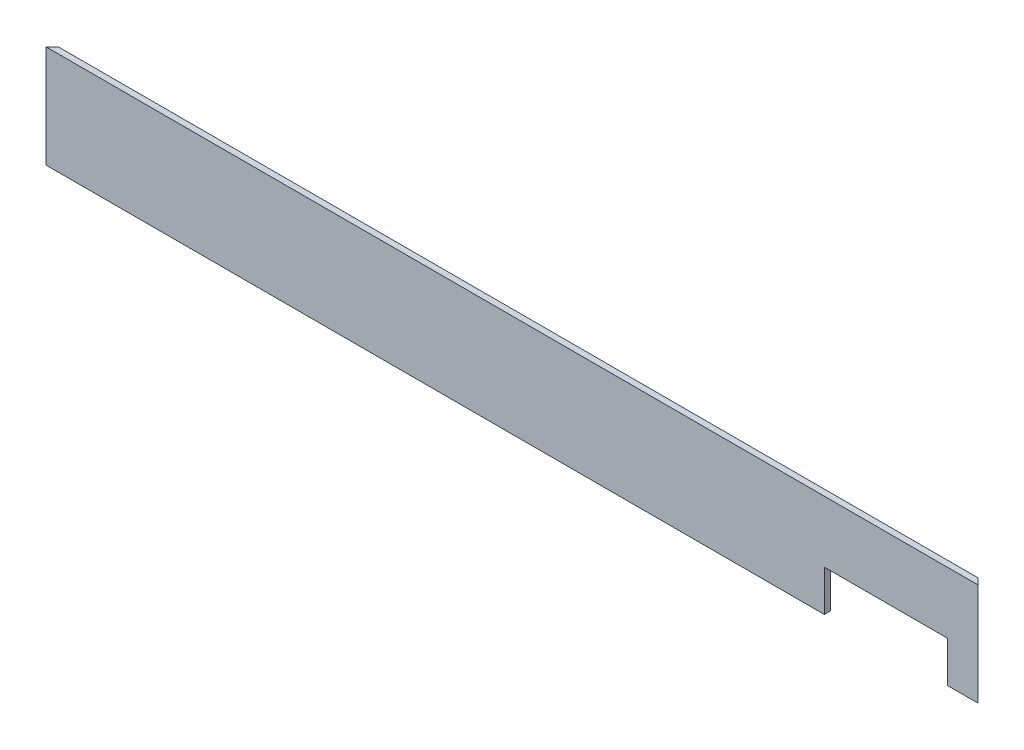
ISO-10303-21;
HEADER;
FILE_DESCRIPTION(('STEP AP214'),'2;1');
FILE_NAME('part.step','',(''),(''),'','','');
FILE_SCHEMA(('AUTOMOTIVE_DESIGN { 1 0 10303 214 1 1 1 1 }'));
ENDSEC;
DATA;
#1=APPLICATION_CONTEXT('core data for automotive mechanical design processes');
#2=APPLICATION_PROTOCOL_DEFINITION('international standard','automotive_design',2000,#1);
#3=PRODUCT_CONTEXT('',#1,'mechanical');
#4=PRODUCT('Part','Part','',(#3));
#5=PRODUCT_RELATED_PRODUCT_CATEGORY('part','',(#4));
#6=PRODUCT_DEFINITION_FORMATION('','',#4);
#7=PRODUCT_DEFINITION_CONTEXT('part definition',#1,'design');
#8=PRODUCT_DEFINITION('design','',#6,#7);
#9=PRODUCT_DEFINITION_SHAPE('','',#8);
#10=(LENGTH_UNIT() NAMED_UNIT(*) SI_UNIT(.MILLI.,.METRE.));
#11=(NAMED_UNIT(*) PLANE_ANGLE_UNIT() SI_UNIT($,.RADIAN.));
#12=(NAMED_UNIT(*) SI_UNIT($,.STERADIAN.) SOLID_ANGLE_UNIT());
#13=UNCERTAINTY_MEASURE_WITH_UNIT(LENGTH_MEASURE(1.E-05),#10,'distance_accuracy_value','');
#14=(GEOMETRIC_REPRESENTATION_CONTEXT(3) GLOBAL_UNCERTAINTY_ASSIGNED_CONTEXT((#13)) GLOBAL_UNIT_ASSIGNED_CONTEXT((#10,
#11,#12)) REPRESENTATION_CONTEXT('',''));
#15=CARTESIAN_POINT('',(0.,0.,0.));
#16=DIRECTION('',(0.,0.,1.));
#17=DIRECTION('',(1.,0.,0.));
#18=AXIS2_PLACEMENT_3D('',#15,#16,#17);
#19=CARTESIAN_POINT('',(0.,0.,0.));
#20=DIRECTION('',(0.,1.,0.));
#21=DIRECTION('',(0.,0.,1.));
#22=AXIS2_PLACEMENT_3D('',#19,#20,#21);
#23=PLANE('',#22);
#24=DIRECTION('',(1.,0.,0.));
#25=VECTOR('',#24,1.);
#26=CARTESIAN_POINT('',(227.5,0.,1.49999999999997));
#27=LINE('',#26,#25);
#28=CARTESIAN_POINT('',(-227.5,0.,1.50000000000003));
#29=VERTEX_POINT('',#28);
#30=CARTESIAN_POINT('',(152.5,0.,1.5));
#31=VERTEX_POINT('',#30);
#32=EDGE_CURVE('E126',#29,#31,#27,.T.);
#33=ORIENTED_EDGE('',*,*,#32,.F.);
#34=DIRECTION('',(0.707106781186544,0.,-0.707106781186551));
#35=VECTOR('',#34,1.);
#36=CARTESIAN_POINT('',(-227.5,0.,1.50000000000003));
#37=LINE('',#36,#35);
#38=CARTESIAN_POINT('',(-224.5,0.,-1.50000000000003));
#39=VERTEX_POINT('',#38);
#40=EDGE_CURVE('E157',#29,#39,#37,.T.);
#41=ORIENTED_EDGE('',*,*,#40,.T.);
#42=DIRECTION('',(-1.,0.,0.));
#43=VECTOR('',#42,1.);
#44=CARTESIAN_POINT('',(227.5,0.,-1.50000000000003));
#45=LINE('',#44,#43);
#46=CARTESIAN_POINT('',(152.5,0.,-1.50000000000003));
#47=VERTEX_POINT('',#46);
#48=EDGE_CURVE('E121',#47,#39,#45,.T.);
#49=ORIENTED_EDGE('',*,*,#48,.F.);
#50=DIRECTION('',(0.,0.,1.));
#51=VECTOR('',#50,1.);
#52=CARTESIAN_POINT('',(152.5,0.,0.));
#53=LINE('',#52,#51);
#54=EDGE_CURVE('E41',#47,#31,#53,.T.);
#55=ORIENTED_EDGE('',*,*,#54,.T.);
#56=EDGE_LOOP('',(#33,#41,#49,#55));
#57=FACE_BOUND('',#56,.T.);
#58=ADVANCED_FACE('F33',(#57),#23,.F.);
#59=CARTESIAN_POINT('',(227.5,50.,1.49999999999997));
#60=DIRECTION('',(0.,0.,-1.));
#61=DIRECTION('',(-1.,0.,0.));
#62=AXIS2_PLACEMENT_3D('',#59,#60,#61);
#63=PLANE('',#62);
#64=ORIENTED_EDGE('',*,*,#32,.T.);
#65=DIRECTION('',(0.,-1.,0.));
#66=VECTOR('',#65,1.);
#67=CARTESIAN_POINT('',(152.5,0.,1.5));
#68=LINE('',#67,#66);
#69=CARTESIAN_POINT('',(152.5,20.,1.5));
#70=VERTEX_POINT('',#69);
#71=EDGE_CURVE('E143',#70,#31,#68,.T.);
#72=ORIENTED_EDGE('',*,*,#71,.F.);
#73=DIRECTION('',(-1.,0.,0.));
#74=VECTOR('',#73,1.);
#75=CARTESIAN_POINT('',(212.5,20.,1.5));
#76=LINE('',#75,#74);
#77=CARTESIAN_POINT('',(212.5,20.,1.5));
#78=VERTEX_POINT('',#77);
#79=EDGE_CURVE('E166',#78,#70,#76,.T.);
#80=ORIENTED_EDGE('',*,*,#79,.F.);
#81=DIRECTION('',(0.,1.,0.));
#82=VECTOR('',#81,1.);
#83=CARTESIAN_POINT('',(212.5,0.,1.5));
#84=LINE('',#83,#82);
#85=CARTESIAN_POINT('',(212.5,0.,1.5));
#86=VERTEX_POINT('',#85);
#87=EDGE_CURVE('E160',#86,#78,#84,.T.);
#88=ORIENTED_EDGE('',*,*,#87,.F.);
#89=CARTESIAN_POINT('',(227.5,0.,1.49999999999997));
#90=VERTEX_POINT('',#89);
#91=EDGE_CURVE('E145',#86,#90,#27,.T.);
#92=ORIENTED_EDGE('',*,*,#91,.T.);
#93=DIRECTION('',(0.,-1.,0.));
#94=VECTOR('',#93,1.);
#95=CARTESIAN_POINT('',(227.5,50.,1.49999999999997));
#96=LINE('',#95,#94);
#97=CARTESIAN_POINT('',(227.5,50.,1.49999999999997));
#98=VERTEX_POINT('',#97);
#99=EDGE_CURVE('E105',#98,#90,#96,.T.);
#100=ORIENTED_EDGE('',*,*,#99,.F.);
#101=DIRECTION('',(1.,0.,0.));
#102=VECTOR('',#101,1.);
#103=CARTESIAN_POINT('',(227.5,50.,1.49999999999997));
#104=LINE('',#103,#102);
#105=CARTESIAN_POINT('',(-227.5,50.,1.50000000000003));
#106=VERTEX_POINT('',#105);
#107=EDGE_CURVE('E120',#106,#98,#104,.T.);
#108=ORIENTED_EDGE('',*,*,#107,.F.);
#109=DIRECTION('',(0.,-1.,0.));
#110=VECTOR('',#109,1.);
#111=CARTESIAN_POINT('',(-227.5,50.,1.50000000000003));
#112=LINE('',#111,#110);
#113=EDGE_CURVE('E57',#106,#29,#112,.T.);
#114=ORIENTED_EDGE('',*,*,#113,.T.);
#115=EDGE_LOOP('',(#64,#72,#80,#88,#92,#100,#108,#114));
#116=FACE_BOUND('',#115,.T.);
#117=ADVANCED_FACE('F35',(#116),#63,.F.);
#118=CARTESIAN_POINT('',(227.5,50.,-1.50000000000003));
#119=DIRECTION('',(0.,0.,1.));
#120=DIRECTION('',(1.,0.,0.));
#121=AXIS2_PLACEMENT_3D('',#118,#119,#120);
#122=PLANE('',#121);
#123=DIRECTION('',(-1.,0.,0.));
#124=VECTOR('',#123,1.);
#125=CARTESIAN_POINT('',(227.5,50.,-1.50000000000003));
#126=LINE('',#125,#124);
#127=CARTESIAN_POINT('',(224.5,50.,-1.50000000000003));
#128=VERTEX_POINT('',#127);
#129=CARTESIAN_POINT('',(-224.5,50.,-1.50000000000003));
#130=VERTEX_POINT('',#129);
#131=EDGE_CURVE('E114',#128,#130,#126,.T.);
#132=ORIENTED_EDGE('',*,*,#131,.F.);
#133=DIRECTION('',(0.,1.,0.));
#134=VECTOR('',#133,1.);
#135=CARTESIAN_POINT('',(224.5,0.,-1.50000000000003));
#136=LINE('',#135,#134);
#137=CARTESIAN_POINT('',(224.5,0.,-1.50000000000003));
#138=VERTEX_POINT('',#137);
#139=EDGE_CURVE('E102',#138,#128,#136,.T.);
#140=ORIENTED_EDGE('',*,*,#139,.F.);
#141=CARTESIAN_POINT('',(212.5,0.,-1.50000000000003));
#142=VERTEX_POINT('',#141);
#143=EDGE_CURVE('E48',#138,#142,#45,.T.);
#144=ORIENTED_EDGE('',*,*,#143,.T.);
#145=DIRECTION('',(0.,1.,0.));
#146=VECTOR('',#145,1.);
#147=CARTESIAN_POINT('',(212.5,50.,-1.50000000000003));
#148=LINE('',#147,#146);
#149=CARTESIAN_POINT('',(212.5,20.,-1.50000000000003));
#150=VERTEX_POINT('',#149);
#151=EDGE_CURVE('E148',#142,#150,#148,.T.);
#152=ORIENTED_EDGE('',*,*,#151,.T.);
#153=DIRECTION('',(-1.,0.,0.));
#154=VECTOR('',#153,1.);
#155=CARTESIAN_POINT('',(227.5,20.,-1.50000000000003));
#156=LINE('',#155,#154);
#157=CARTESIAN_POINT('',(152.5,20.,-1.50000000000002));
#158=VERTEX_POINT('',#157);
#159=EDGE_CURVE('E11',#150,#158,#156,.T.);
#160=ORIENTED_EDGE('',*,*,#159,.T.);
#161=DIRECTION('',(0.,-1.,0.));
#162=VECTOR('',#161,1.);
#163=CARTESIAN_POINT('',(152.5,50.,-1.50000000000002));
#164=LINE('',#163,#162);
#165=EDGE_CURVE('E146',#158,#47,#164,.T.);
#166=ORIENTED_EDGE('',*,*,#165,.T.);
#167=ORIENTED_EDGE('',*,*,#48,.T.);
#168=DIRECTION('',(0.,1.,0.));
#169=VECTOR('',#168,1.);
#170=CARTESIAN_POINT('',(-224.5,0.,-1.50000000000003));
#171=LINE('',#170,#169);
#172=EDGE_CURVE('E156',#39,#130,#171,.T.);
#173=ORIENTED_EDGE('',*,*,#172,.T.);
#174=EDGE_LOOP('',(#132,#140,#144,#152,#160,#166,#167,#173));
#175=FACE_BOUND('',#174,.T.);
#176=ADVANCED_FACE('F112',(#175),#122,.F.);
#177=CARTESIAN_POINT('',(0.,50.,0.));
#178=DIRECTION('',(0.,1.,0.));
#179=DIRECTION('',(0.,0.,1.));
#180=AXIS2_PLACEMENT_3D('',#177,#178,#179);
#181=PLANE('',#180);
#182=DIRECTION('',(0.707106781186544,0.,0.70710678118655));
#183=VECTOR('',#182,1.);
#184=CARTESIAN_POINT('',(227.5,50.,1.49999999999997));
#185=LINE('',#184,#183);
#186=EDGE_CURVE('E109',#128,#98,#185,.T.);
#187=ORIENTED_EDGE('',*,*,#186,.F.);
#188=ORIENTED_EDGE('',*,*,#131,.T.);
#189=DIRECTION('',(0.707106781186544,0.,-0.707106781186551));
#190=VECTOR('',#189,1.);
#191=CARTESIAN_POINT('',(-227.5,50.,1.50000000000003));
#192=LINE('',#191,#190);
#193=EDGE_CURVE('E115',#106,#130,#192,.T.);
#194=ORIENTED_EDGE('',*,*,#193,.F.);
#195=ORIENTED_EDGE('',*,*,#107,.T.);
#196=EDGE_LOOP('',(#187,#188,#194,#195));
#197=FACE_BOUND('',#196,.T.);
#198=ADVANCED_FACE('F154',(#197),#181,.T.);
#199=ORIENTED_EDGE('',*,*,#143,.F.);
#200=DIRECTION('',(0.707106781186544,0.,0.70710678118655));
#201=VECTOR('',#200,1.);
#202=CARTESIAN_POINT('',(227.5,0.,1.49999999999997));
#203=LINE('',#202,#201);
#204=EDGE_CURVE('E100',#138,#90,#203,.T.);
#205=ORIENTED_EDGE('',*,*,#204,.T.);
#206=ORIENTED_EDGE('',*,*,#91,.F.);
#207=DIRECTION('',(0.,0.,-1.));
#208=VECTOR('',#207,1.);
#209=CARTESIAN_POINT('',(212.5,0.,0.));
#210=LINE('',#209,#208);
#211=EDGE_CURVE('E119',#86,#142,#210,.T.);
#212=ORIENTED_EDGE('',*,*,#211,.T.);
#213=EDGE_LOOP('',(#199,#205,#206,#212));
#214=FACE_BOUND('',#213,.T.);
#215=ADVANCED_FACE('F118',(#214),#23,.F.);
#216=CARTESIAN_POINT('',(212.5,20.,-53.5));
#217=DIRECTION('',(0.,1.,0.));
#218=DIRECTION('',(-1.,0.,0.));
#219=AXIS2_PLACEMENT_3D('',#216,#217,#218);
#220=PLANE('',#219);
#221=DIRECTION('',(0.,0.,1.));
#222=VECTOR('',#221,1.);
#223=CARTESIAN_POINT('',(212.5,20.,-53.5));
#224=LINE('',#223,#222);
#225=EDGE_CURVE('E169',#150,#78,#224,.T.);
#226=ORIENTED_EDGE('',*,*,#225,.T.);
#227=ORIENTED_EDGE('',*,*,#79,.T.);
#228=DIRECTION('',(0.,0.,1.));
#229=VECTOR('',#228,1.);
#230=CARTESIAN_POINT('',(152.5,20.,-53.5));
#231=LINE('',#230,#229);
#232=EDGE_CURVE('E150',#158,#70,#231,.T.);
#233=ORIENTED_EDGE('',*,*,#232,.F.);
#234=ORIENTED_EDGE('',*,*,#159,.F.);
#235=EDGE_LOOP('',(#226,#227,#233,#234));
#236=FACE_BOUND('',#235,.T.);
#237=ADVANCED_FACE('F172',(#236),#220,.F.);
#238=CARTESIAN_POINT('',(152.5,0.,-53.5));
#239=DIRECTION('',(-1.,0.,0.));
#240=DIRECTION('',(0.,0.,1.));
#241=AXIS2_PLACEMENT_3D('',#238,#239,#240);
#242=PLANE('',#241);
#243=ORIENTED_EDGE('',*,*,#232,.T.);
#244=ORIENTED_EDGE('',*,*,#71,.T.);
#245=ORIENTED_EDGE('',*,*,#54,.F.);
#246=ORIENTED_EDGE('',*,*,#165,.F.);
#247=EDGE_LOOP('',(#243,#244,#245,#246));
#248=FACE_BOUND('',#247,.T.);
#249=ADVANCED_FACE('F177',(#248),#242,.F.);
#250=CARTESIAN_POINT('',(212.5,0.,-53.5));
#251=DIRECTION('',(1.,0.,0.));
#252=DIRECTION('',(0.,0.,-1.));
#253=AXIS2_PLACEMENT_3D('',#250,#251,#252);
#254=PLANE('',#253);
#255=ORIENTED_EDGE('',*,*,#211,.F.);
#256=ORIENTED_EDGE('',*,*,#87,.T.);
#257=ORIENTED_EDGE('',*,*,#225,.F.);
#258=ORIENTED_EDGE('',*,*,#151,.F.);
#259=EDGE_LOOP('',(#255,#256,#257,#258));
#260=FACE_BOUND('',#259,.T.);
#261=ADVANCED_FACE('F175',(#260),#254,.F.);
#262=CARTESIAN_POINT('',(-227.5,0.,1.50000000000003));
#263=DIRECTION('',(0.707106781186551,0.,0.707106781186544));
#264=DIRECTION('',(0.707106781186544,0.,-0.707106781186551));
#265=AXIS2_PLACEMENT_3D('',#262,#263,#264);
#266=PLANE('',#265);
#267=ORIENTED_EDGE('',*,*,#193,.T.);
#268=ORIENTED_EDGE('',*,*,#172,.F.);
#269=ORIENTED_EDGE('',*,*,#40,.F.);
#270=ORIENTED_EDGE('',*,*,#113,.F.);
#271=EDGE_LOOP('',(#267,#268,#269,#270));
#272=FACE_BOUND('',#271,.T.);
#273=ADVANCED_FACE('F155',(#272),#266,.F.);
#274=CARTESIAN_POINT('',(227.5,0.,1.49999999999997));
#275=DIRECTION('',(-0.707106781186551,0.,0.707106781186544));
#276=DIRECTION('',(0.707106781186544,0.,0.707106781186551));
#277=AXIS2_PLACEMENT_3D('',#274,#275,#276);
#278=PLANE('',#277);
#279=ORIENTED_EDGE('',*,*,#186,.T.);
#280=ORIENTED_EDGE('',*,*,#99,.T.);
#281=ORIENTED_EDGE('',*,*,#204,.F.);
#282=ORIENTED_EDGE('',*,*,#139,.T.);
#283=EDGE_LOOP('',(#279,#280,#281,#282));
#284=FACE_BOUND('',#283,.T.);
#285=ADVANCED_FACE('F101',(#284),#278,.F.);
#286=CLOSED_SHELL('',(#58,#117,#176,#198,#215,#237,#249,#261,#273,#285));
#287=MANIFOLD_SOLID_BREP('B2',#286);
#288=ADVANCED_BREP_SHAPE_REPRESENTATION('',(#18,#287),#14);
#289=SHAPE_DEFINITION_REPRESENTATION(#9,#288);
ENDSEC;
END-ISO-10303-21;
